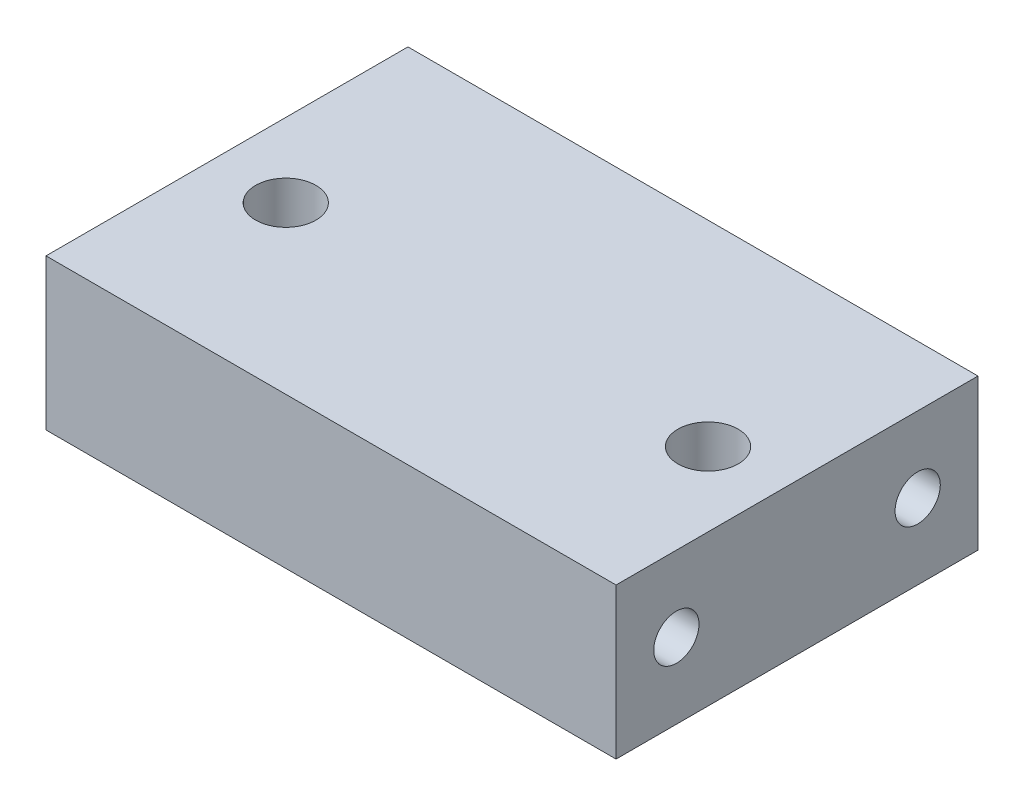
ISO-10303-21;
HEADER;
FILE_DESCRIPTION(('STEP AP214'),'2;1');
FILE_NAME('part.step','',(''),(''),'','','');
FILE_SCHEMA(('AUTOMOTIVE_DESIGN { 1 0 10303 214 1 1 1 1 }'));
ENDSEC;
DATA;
#1=APPLICATION_CONTEXT('core data for automotive mechanical design processes');
#2=APPLICATION_PROTOCOL_DEFINITION('international standard','automotive_design',2000,#1);
#3=PRODUCT_CONTEXT('',#1,'mechanical');
#4=PRODUCT('Part','Part','',(#3));
#5=PRODUCT_RELATED_PRODUCT_CATEGORY('part','',(#4));
#6=PRODUCT_DEFINITION_FORMATION('','',#4);
#7=PRODUCT_DEFINITION_CONTEXT('part definition',#1,'design');
#8=PRODUCT_DEFINITION('design','',#6,#7);
#9=PRODUCT_DEFINITION_SHAPE('','',#8);
#10=(LENGTH_UNIT() NAMED_UNIT(*) SI_UNIT(.MILLI.,.METRE.));
#11=(NAMED_UNIT(*) PLANE_ANGLE_UNIT() SI_UNIT($,.RADIAN.));
#12=(NAMED_UNIT(*) SI_UNIT($,.STERADIAN.) SOLID_ANGLE_UNIT());
#13=UNCERTAINTY_MEASURE_WITH_UNIT(LENGTH_MEASURE(1.E-05),#10,'distance_accuracy_value','');
#14=(GEOMETRIC_REPRESENTATION_CONTEXT(3) GLOBAL_UNCERTAINTY_ASSIGNED_CONTEXT((#13)) GLOBAL_UNIT_ASSIGNED_CONTEXT((#10,
#11,#12)) REPRESENTATION_CONTEXT('',''));
#15=CARTESIAN_POINT('',(0.,0.,0.));
#16=DIRECTION('',(0.,0.,1.));
#17=DIRECTION('',(1.,0.,0.));
#18=AXIS2_PLACEMENT_3D('',#15,#16,#17);
#19=CARTESIAN_POINT('',(18.9,10.,12.));
#20=DIRECTION('',(-1.,0.,0.));
#21=DIRECTION('',(0.,0.,1.));
#22=AXIS2_PLACEMENT_3D('',#19,#20,#21);
#23=PLANE('',#22);
#24=CARTESIAN_POINT('',(18.9,5.,8.));
#25=DIRECTION('',(1.,0.,0.));
#26=DIRECTION('',(0.,0.,-1.));
#27=AXIS2_PLACEMENT_3D('',#24,#25,#26);
#28=CIRCLE('',#27,1.49999999999999);
#29=CARTESIAN_POINT('',(18.9,5.,6.50000000000001));
#30=VERTEX_POINT('',#29);
#31=EDGE_CURVE('E158',#30,#30,#28,.T.);
#32=ORIENTED_EDGE('',*,*,#31,.F.);
#33=EDGE_LOOP('',(#32));
#34=FACE_BOUND('',#33,.T.);
#35=CARTESIAN_POINT('',(18.9,5.,-8.));
#36=DIRECTION('',(1.,0.,0.));
#37=DIRECTION('',(0.,0.,-1.));
#38=AXIS2_PLACEMENT_3D('',#35,#36,#37);
#39=CIRCLE('',#38,1.49999999999999);
#40=CARTESIAN_POINT('',(18.9,5.,-9.49999999999999));
#41=VERTEX_POINT('',#40);
#42=EDGE_CURVE('E174',#41,#41,#39,.T.);
#43=ORIENTED_EDGE('',*,*,#42,.F.);
#44=EDGE_LOOP('',(#43));
#45=FACE_BOUND('',#44,.T.);
#46=DIRECTION('',(0.,0.,-1.));
#47=VECTOR('',#46,1.);
#48=CARTESIAN_POINT('',(18.9,0.,12.));
#49=LINE('',#48,#47);
#50=CARTESIAN_POINT('',(18.9,0.,12.));
#51=VERTEX_POINT('',#50);
#52=CARTESIAN_POINT('',(18.9,0.,-12.));
#53=VERTEX_POINT('',#52);
#54=EDGE_CURVE('E221',#51,#53,#49,.T.);
#55=ORIENTED_EDGE('',*,*,#54,.T.);
#56=DIRECTION('',(0.,-1.,0.));
#57=VECTOR('',#56,1.);
#58=CARTESIAN_POINT('',(18.9,10.,-12.));
#59=LINE('',#58,#57);
#60=CARTESIAN_POINT('',(18.9,10.,-12.));
#61=VERTEX_POINT('',#60);
#62=EDGE_CURVE('E11',#61,#53,#59,.T.);
#63=ORIENTED_EDGE('',*,*,#62,.F.);
#64=DIRECTION('',(0.,0.,-1.));
#65=VECTOR('',#64,1.);
#66=CARTESIAN_POINT('',(18.9,10.,12.));
#67=LINE('',#66,#65);
#68=CARTESIAN_POINT('',(18.9,10.,12.));
#69=VERTEX_POINT('',#68);
#70=EDGE_CURVE('E222',#69,#61,#67,.T.);
#71=ORIENTED_EDGE('',*,*,#70,.F.);
#72=DIRECTION('',(0.,-1.,0.));
#73=VECTOR('',#72,1.);
#74=CARTESIAN_POINT('',(18.9,10.,12.));
#75=LINE('',#74,#73);
#76=EDGE_CURVE('E232',#69,#51,#75,.T.);
#77=ORIENTED_EDGE('',*,*,#76,.T.);
#78=EDGE_LOOP('',(#55,#63,#71,#77));
#79=FACE_BOUND('',#78,.T.);
#80=ADVANCED_FACE('F41',(#34,#45,#79),#23,.F.);
#81=CARTESIAN_POINT('',(-18.9,10.,-12.));
#82=DIRECTION('',(0.,0.,1.));
#83=DIRECTION('',(1.,0.,0.));
#84=AXIS2_PLACEMENT_3D('',#81,#82,#83);
#85=PLANE('',#84);
#86=DIRECTION('',(-1.,0.,0.));
#87=VECTOR('',#86,1.);
#88=CARTESIAN_POINT('',(-18.9,0.,-12.));
#89=LINE('',#88,#87);
#90=CARTESIAN_POINT('',(-18.9,0.,-12.));
#91=VERTEX_POINT('',#90);
#92=EDGE_CURVE('E236',#53,#91,#89,.T.);
#93=ORIENTED_EDGE('',*,*,#92,.T.);
#94=DIRECTION('',(0.,-1.,0.));
#95=VECTOR('',#94,1.);
#96=CARTESIAN_POINT('',(-18.9,10.,-12.));
#97=LINE('',#96,#95);
#98=CARTESIAN_POINT('',(-18.9,10.,-12.));
#99=VERTEX_POINT('',#98);
#100=EDGE_CURVE('E50',#99,#91,#97,.T.);
#101=ORIENTED_EDGE('',*,*,#100,.F.);
#102=DIRECTION('',(-1.,0.,0.));
#103=VECTOR('',#102,1.);
#104=CARTESIAN_POINT('',(-18.9,10.,-12.));
#105=LINE('',#104,#103);
#106=EDGE_CURVE('E99',#61,#99,#105,.T.);
#107=ORIENTED_EDGE('',*,*,#106,.F.);
#108=ORIENTED_EDGE('',*,*,#62,.T.);
#109=EDGE_LOOP('',(#93,#101,#107,#108));
#110=FACE_BOUND('',#109,.T.);
#111=ADVANCED_FACE('F266',(#110),#85,.F.);
#112=CARTESIAN_POINT('',(-18.9,10.,12.));
#113=DIRECTION('',(1.,0.,0.));
#114=DIRECTION('',(0.,0.,-1.));
#115=AXIS2_PLACEMENT_3D('',#112,#113,#114);
#116=PLANE('',#115);
#117=CARTESIAN_POINT('',(-18.9,5.,8.));
#118=DIRECTION('',(-1.,0.,0.));
#119=DIRECTION('',(0.,0.,1.));
#120=AXIS2_PLACEMENT_3D('',#117,#118,#119);
#121=CIRCLE('',#120,1.49999999999999);
#122=CARTESIAN_POINT('',(-18.9,5.,9.49999999999999));
#123=VERTEX_POINT('',#122);
#124=EDGE_CURVE('E510',#123,#123,#121,.T.);
#125=ORIENTED_EDGE('',*,*,#124,.F.);
#126=EDGE_LOOP('',(#125));
#127=FACE_BOUND('',#126,.T.);
#128=CARTESIAN_POINT('',(-18.9,5.,-8.));
#129=DIRECTION('',(-1.,0.,0.));
#130=DIRECTION('',(0.,0.,1.));
#131=AXIS2_PLACEMENT_3D('',#128,#129,#130);
#132=CIRCLE('',#131,1.49999999999999);
#133=CARTESIAN_POINT('',(-18.9,5.,-6.50000000000001));
#134=VERTEX_POINT('',#133);
#135=EDGE_CURVE('E133',#134,#134,#132,.T.);
#136=ORIENTED_EDGE('',*,*,#135,.F.);
#137=EDGE_LOOP('',(#136));
#138=FACE_BOUND('',#137,.T.);
#139=DIRECTION('',(0.,0.,1.));
#140=VECTOR('',#139,1.);
#141=CARTESIAN_POINT('',(-18.9,0.,12.));
#142=LINE('',#141,#140);
#143=CARTESIAN_POINT('',(-18.9,0.,12.));
#144=VERTEX_POINT('',#143);
#145=EDGE_CURVE('E84',#91,#144,#142,.T.);
#146=ORIENTED_EDGE('',*,*,#145,.T.);
#147=DIRECTION('',(0.,-1.,0.));
#148=VECTOR('',#147,1.);
#149=CARTESIAN_POINT('',(-18.9,10.,12.));
#150=LINE('',#149,#148);
#151=CARTESIAN_POINT('',(-18.9,10.,12.));
#152=VERTEX_POINT('',#151);
#153=EDGE_CURVE('E245',#152,#144,#150,.T.);
#154=ORIENTED_EDGE('',*,*,#153,.F.);
#155=DIRECTION('',(0.,0.,1.));
#156=VECTOR('',#155,1.);
#157=CARTESIAN_POINT('',(-18.9,10.,12.));
#158=LINE('',#157,#156);
#159=EDGE_CURVE('E227',#99,#152,#158,.T.);
#160=ORIENTED_EDGE('',*,*,#159,.F.);
#161=ORIENTED_EDGE('',*,*,#100,.T.);
#162=EDGE_LOOP('',(#146,#154,#160,#161));
#163=FACE_BOUND('',#162,.T.);
#164=ADVANCED_FACE('F249',(#127,#138,#163),#116,.F.);
#165=CARTESIAN_POINT('',(-18.9,10.,12.));
#166=DIRECTION('',(0.,0.,-1.));
#167=DIRECTION('',(-1.,0.,0.));
#168=AXIS2_PLACEMENT_3D('',#165,#166,#167);
#169=PLANE('',#168);
#170=DIRECTION('',(1.,0.,0.));
#171=VECTOR('',#170,1.);
#172=CARTESIAN_POINT('',(-18.9,0.,12.));
#173=LINE('',#172,#171);
#174=EDGE_CURVE('E92',#144,#51,#173,.T.);
#175=ORIENTED_EDGE('',*,*,#174,.T.);
#176=ORIENTED_EDGE('',*,*,#76,.F.);
#177=DIRECTION('',(1.,0.,0.));
#178=VECTOR('',#177,1.);
#179=CARTESIAN_POINT('',(-18.9,10.,12.));
#180=LINE('',#179,#178);
#181=EDGE_CURVE('E61',#152,#69,#180,.T.);
#182=ORIENTED_EDGE('',*,*,#181,.F.);
#183=ORIENTED_EDGE('',*,*,#153,.T.);
#184=EDGE_LOOP('',(#175,#176,#182,#183));
#185=FACE_BOUND('',#184,.T.);
#186=ADVANCED_FACE('F256',(#185),#169,.F.);
#187=CARTESIAN_POINT('',(0.,10.,0.));
#188=DIRECTION('',(0.,-1.,0.));
#189=DIRECTION('',(0.,0.,-1.));
#190=AXIS2_PLACEMENT_3D('',#187,#188,#189);
#191=PLANE('',#190);
#192=CARTESIAN_POINT('',(-14.,10.,1.));
#193=DIRECTION('',(0.,1.,0.));
#194=DIRECTION('',(0.,0.,1.));
#195=AXIS2_PLACEMENT_3D('',#192,#193,#194);
#196=CIRCLE('',#195,1.99999999999999);
#197=CARTESIAN_POINT('',(-14.,10.,3.));
#198=VERTEX_POINT('',#197);
#199=EDGE_CURVE('E190',#198,#198,#196,.T.);
#200=ORIENTED_EDGE('',*,*,#199,.F.);
#201=EDGE_LOOP('',(#200));
#202=FACE_BOUND('',#201,.T.);
#203=CARTESIAN_POINT('',(14.,10.,1.));
#204=DIRECTION('',(0.,1.,0.));
#205=DIRECTION('',(0.,0.,1.));
#206=AXIS2_PLACEMENT_3D('',#203,#204,#205);
#207=CIRCLE('',#206,1.99999999999999);
#208=CARTESIAN_POINT('',(14.,10.,2.99999999999999));
#209=VERTEX_POINT('',#208);
#210=EDGE_CURVE('E205',#209,#209,#207,.T.);
#211=ORIENTED_EDGE('',*,*,#210,.F.);
#212=EDGE_LOOP('',(#211));
#213=FACE_BOUND('',#212,.T.);
#214=ORIENTED_EDGE('',*,*,#70,.T.);
#215=ORIENTED_EDGE('',*,*,#106,.T.);
#216=ORIENTED_EDGE('',*,*,#159,.T.);
#217=ORIENTED_EDGE('',*,*,#181,.T.);
#218=EDGE_LOOP('',(#214,#215,#216,#217));
#219=FACE_BOUND('',#218,.T.);
#220=ADVANCED_FACE('F258',(#202,#213,#219),#191,.F.);
#221=CARTESIAN_POINT('',(0.,0.,0.));
#222=DIRECTION('',(0.,-1.,0.));
#223=DIRECTION('',(0.,0.,-1.));
#224=AXIS2_PLACEMENT_3D('',#221,#222,#223);
#225=PLANE('',#224);
#226=ORIENTED_EDGE('',*,*,#54,.F.);
#227=ORIENTED_EDGE('',*,*,#174,.F.);
#228=ORIENTED_EDGE('',*,*,#145,.F.);
#229=ORIENTED_EDGE('',*,*,#92,.F.);
#230=EDGE_LOOP('',(#226,#227,#228,#229));
#231=FACE_BOUND('',#230,.T.);
#232=ADVANCED_FACE('F252',(#231),#225,.T.);
#233=CARTESIAN_POINT('',(14.,2.5,1.));
#234=DIRECTION('',(0.,1.,0.));
#235=DIRECTION('',(0.,0.,1.));
#236=AXIS2_PLACEMENT_3D('',#233,#234,#235);
#237=CONICAL_SURFACE('',#236,1.65,1.02974425867665);
#238=CARTESIAN_POINT('',(14.,1.50857997860453,1.));
#239=VERTEX_POINT('',#238);
#240=VERTEX_LOOP('',#239);
#241=FACE_BOUND('',#240,.T.);
#242=CARTESIAN_POINT('',(14.,2.5,1.));
#243=DIRECTION('',(0.,1.,0.));
#244=DIRECTION('',(0.,0.,1.));
#245=AXIS2_PLACEMENT_3D('',#242,#243,#244);
#246=CIRCLE('',#245,1.65);
#247=CARTESIAN_POINT('',(14.,2.5,2.65));
#248=VERTEX_POINT('',#247);
#249=EDGE_CURVE('E217',#248,#248,#246,.T.);
#250=ORIENTED_EDGE('',*,*,#249,.T.);
#251=EDGE_LOOP('',(#250));
#252=FACE_BOUND('',#251,.T.);
#253=ADVANCED_FACE('F332',(#241,#252),#237,.F.);
#254=CARTESIAN_POINT('',(14.,10.,1.));
#255=DIRECTION('',(0.,1.,0.));
#256=DIRECTION('',(0.,0.,1.));
#257=AXIS2_PLACEMENT_3D('',#254,#255,#256);
#258=CYLINDRICAL_SURFACE('',#257,1.65);
#259=ORIENTED_EDGE('',*,*,#249,.F.);
#260=EDGE_LOOP('',(#259));
#261=FACE_BOUND('',#260,.T.);
#262=CARTESIAN_POINT('',(14.,2.,1.));
#263=DIRECTION('',(0.,1.,0.));
#264=DIRECTION('',(0.,0.,1.));
#265=AXIS2_PLACEMENT_3D('',#262,#263,#264);
#266=CIRCLE('',#265,1.65);
#267=CARTESIAN_POINT('',(14.,2.,2.65));
#268=VERTEX_POINT('',#267);
#269=EDGE_CURVE('E213',#268,#268,#266,.T.);
#270=ORIENTED_EDGE('',*,*,#269,.T.);
#271=EDGE_LOOP('',(#270));
#272=FACE_BOUND('',#271,.T.);
#273=ADVANCED_FACE('F328',(#261,#272),#258,.T.);
#274=CARTESIAN_POINT('',(15.65,2.,1.));
#275=DIRECTION('',(0.,-1.,0.));
#276=DIRECTION('',(0.,0.,-1.));
#277=AXIS2_PLACEMENT_3D('',#274,#275,#276);
#278=PLANE('',#277);
#279=ORIENTED_EDGE('',*,*,#269,.F.);
#280=EDGE_LOOP('',(#279));
#281=FACE_BOUND('',#280,.T.);
#282=CARTESIAN_POINT('',(14.,2.,1.));
#283=DIRECTION('',(0.,1.,0.));
#284=DIRECTION('',(0.,0.,1.));
#285=AXIS2_PLACEMENT_3D('',#282,#283,#284);
#286=CIRCLE('',#285,2.);
#287=CARTESIAN_POINT('',(14.,2.,3.));
#288=VERTEX_POINT('',#287);
#289=EDGE_CURVE('E209',#288,#288,#286,.T.);
#290=ORIENTED_EDGE('',*,*,#289,.T.);
#291=EDGE_LOOP('',(#290));
#292=FACE_BOUND('',#291,.T.);
#293=ADVANCED_FACE('F324',(#281,#292),#278,.F.);
#294=CARTESIAN_POINT('',(14.,10.,1.));
#295=DIRECTION('',(0.,1.,0.));
#296=DIRECTION('',(0.,0.,1.));
#297=AXIS2_PLACEMENT_3D('',#294,#295,#296);
#298=CYLINDRICAL_SURFACE('',#297,1.99999999999999);
#299=ORIENTED_EDGE('',*,*,#289,.F.);
#300=EDGE_LOOP('',(#299));
#301=FACE_BOUND('',#300,.T.);
#302=ORIENTED_EDGE('',*,*,#210,.T.);
#303=EDGE_LOOP('',(#302));
#304=FACE_BOUND('',#303,.T.);
#305=ADVANCED_FACE('F320',(#301,#304),#298,.F.);
#306=CARTESIAN_POINT('',(-14.,2.5,1.));
#307=DIRECTION('',(0.,1.,0.));
#308=DIRECTION('',(0.,0.,1.));
#309=AXIS2_PLACEMENT_3D('',#306,#307,#308);
#310=CONICAL_SURFACE('',#309,1.65,1.02974425867665);
#311=CARTESIAN_POINT('',(-14.,1.50857997860453,1.));
#312=VERTEX_POINT('',#311);
#313=VERTEX_LOOP('',#312);
#314=FACE_BOUND('',#313,.T.);
#315=CARTESIAN_POINT('',(-14.,2.5,1.));
#316=DIRECTION('',(0.,1.,0.));
#317=DIRECTION('',(0.,0.,1.));
#318=AXIS2_PLACEMENT_3D('',#315,#316,#317);
#319=CIRCLE('',#318,1.65);
#320=CARTESIAN_POINT('',(-14.,2.5,2.65));
#321=VERTEX_POINT('',#320);
#322=EDGE_CURVE('E201',#321,#321,#319,.T.);
#323=ORIENTED_EDGE('',*,*,#322,.T.);
#324=EDGE_LOOP('',(#323));
#325=FACE_BOUND('',#324,.T.);
#326=ADVANCED_FACE('F316',(#314,#325),#310,.F.);
#327=CARTESIAN_POINT('',(-14.,10.,1.));
#328=DIRECTION('',(0.,1.,0.));
#329=DIRECTION('',(0.,0.,1.));
#330=AXIS2_PLACEMENT_3D('',#327,#328,#329);
#331=CYLINDRICAL_SURFACE('',#330,1.65);
#332=ORIENTED_EDGE('',*,*,#322,.F.);
#333=EDGE_LOOP('',(#332));
#334=FACE_BOUND('',#333,.T.);
#335=CARTESIAN_POINT('',(-14.,2.,1.));
#336=DIRECTION('',(0.,1.,0.));
#337=DIRECTION('',(0.,0.,1.));
#338=AXIS2_PLACEMENT_3D('',#335,#336,#337);
#339=CIRCLE('',#338,1.65);
#340=CARTESIAN_POINT('',(-14.,2.,2.65));
#341=VERTEX_POINT('',#340);
#342=EDGE_CURVE('E197',#341,#341,#339,.T.);
#343=ORIENTED_EDGE('',*,*,#342,.T.);
#344=EDGE_LOOP('',(#343));
#345=FACE_BOUND('',#344,.T.);
#346=ADVANCED_FACE('F312',(#334,#345),#331,.T.);
#347=CARTESIAN_POINT('',(-12.35,2.,1.));
#348=DIRECTION('',(0.,-1.,0.));
#349=DIRECTION('',(0.,0.,-1.));
#350=AXIS2_PLACEMENT_3D('',#347,#348,#349);
#351=PLANE('',#350);
#352=ORIENTED_EDGE('',*,*,#342,.F.);
#353=EDGE_LOOP('',(#352));
#354=FACE_BOUND('',#353,.T.);
#355=CARTESIAN_POINT('',(-14.,2.,1.));
#356=DIRECTION('',(0.,1.,0.));
#357=DIRECTION('',(0.,0.,1.));
#358=AXIS2_PLACEMENT_3D('',#355,#356,#357);
#359=CIRCLE('',#358,1.99999999999999);
#360=CARTESIAN_POINT('',(-14.,2.,3.));
#361=VERTEX_POINT('',#360);
#362=EDGE_CURVE('E193',#361,#361,#359,.T.);
#363=ORIENTED_EDGE('',*,*,#362,.T.);
#364=EDGE_LOOP('',(#363));
#365=FACE_BOUND('',#364,.T.);
#366=ADVANCED_FACE('F308',(#354,#365),#351,.F.);
#367=CARTESIAN_POINT('',(-14.,10.,1.));
#368=DIRECTION('',(0.,1.,0.));
#369=DIRECTION('',(0.,0.,1.));
#370=AXIS2_PLACEMENT_3D('',#367,#368,#369);
#371=CYLINDRICAL_SURFACE('',#370,1.99999999999999);
#372=ORIENTED_EDGE('',*,*,#362,.F.);
#373=EDGE_LOOP('',(#372));
#374=FACE_BOUND('',#373,.T.);
#375=ORIENTED_EDGE('',*,*,#199,.T.);
#376=EDGE_LOOP('',(#375));
#377=FACE_BOUND('',#376,.T.);
#378=ADVANCED_FACE('F304',(#374,#377),#371,.F.);
#379=CARTESIAN_POINT('',(6.89999999999999,5.,-8.));
#380=DIRECTION('',(1.,0.,0.));
#381=DIRECTION('',(0.,0.,-1.));
#382=AXIS2_PLACEMENT_3D('',#379,#380,#381);
#383=CONICAL_SURFACE('',#382,1.25,1.02974425867665);
#384=CARTESIAN_POINT('',(6.14892422621554,5.,-8.));
#385=VERTEX_POINT('',#384);
#386=VERTEX_LOOP('',#385);
#387=FACE_BOUND('',#386,.T.);
#388=CARTESIAN_POINT('',(6.89999999999999,5.,-8.));
#389=DIRECTION('',(1.,0.,0.));
#390=DIRECTION('',(0.,0.,-1.));
#391=AXIS2_PLACEMENT_3D('',#388,#389,#390);
#392=CIRCLE('',#391,1.25);
#393=CARTESIAN_POINT('',(6.89999999999999,5.,-9.25));
#394=VERTEX_POINT('',#393);
#395=EDGE_CURVE('E186',#394,#394,#392,.T.);
#396=ORIENTED_EDGE('',*,*,#395,.T.);
#397=EDGE_LOOP('',(#396));
#398=FACE_BOUND('',#397,.T.);
#399=ADVANCED_FACE('F300',(#387,#398),#383,.F.);
#400=CARTESIAN_POINT('',(18.9,5.,-8.));
#401=DIRECTION('',(1.,0.,0.));
#402=DIRECTION('',(0.,0.,-1.));
#403=AXIS2_PLACEMENT_3D('',#400,#401,#402);
#404=CYLINDRICAL_SURFACE('',#403,1.25);
#405=ORIENTED_EDGE('',*,*,#395,.F.);
#406=EDGE_LOOP('',(#405));
#407=FACE_BOUND('',#406,.T.);
#408=CARTESIAN_POINT('',(7.39999999999999,5.,-8.));
#409=DIRECTION('',(1.,0.,0.));
#410=DIRECTION('',(0.,0.,-1.));
#411=AXIS2_PLACEMENT_3D('',#408,#409,#410);
#412=CIRCLE('',#411,1.25);
#413=CARTESIAN_POINT('',(7.39999999999999,5.,-9.25));
#414=VERTEX_POINT('',#413);
#415=EDGE_CURVE('E182',#414,#414,#412,.T.);
#416=ORIENTED_EDGE('',*,*,#415,.T.);
#417=EDGE_LOOP('',(#416));
#418=FACE_BOUND('',#417,.T.);
#419=ADVANCED_FACE('F292',(#407,#418),#404,.F.);
#420=CARTESIAN_POINT('',(7.39999999999999,6.25,-8.));
#421=DIRECTION('',(-1.,0.,0.));
#422=DIRECTION('',(0.,0.,1.));
#423=AXIS2_PLACEMENT_3D('',#420,#421,#422);
#424=PLANE('',#423);
#425=ORIENTED_EDGE('',*,*,#415,.F.);
#426=EDGE_LOOP('',(#425));
#427=FACE_BOUND('',#426,.T.);
#428=CARTESIAN_POINT('',(7.39999999999999,5.,-8.));
#429=DIRECTION('',(1.,0.,0.));
#430=DIRECTION('',(0.,0.,-1.));
#431=AXIS2_PLACEMENT_3D('',#428,#429,#430);
#432=CIRCLE('',#431,1.5);
#433=CARTESIAN_POINT('',(7.39999999999999,5.,-9.5));
#434=VERTEX_POINT('',#433);
#435=EDGE_CURVE('E178',#434,#434,#432,.T.);
#436=ORIENTED_EDGE('',*,*,#435,.T.);
#437=EDGE_LOOP('',(#436));
#438=FACE_BOUND('',#437,.T.);
#439=ADVANCED_FACE('F282',(#427,#438),#424,.F.);
#440=CARTESIAN_POINT('',(18.9,5.,-8.));
#441=DIRECTION('',(1.,0.,0.));
#442=DIRECTION('',(0.,0.,-1.));
#443=AXIS2_PLACEMENT_3D('',#440,#441,#442);
#444=CYLINDRICAL_SURFACE('',#443,1.5);
#445=ORIENTED_EDGE('',*,*,#435,.F.);
#446=EDGE_LOOP('',(#445));
#447=FACE_BOUND('',#446,.T.);
#448=ORIENTED_EDGE('',*,*,#42,.T.);
#449=EDGE_LOOP('',(#448));
#450=FACE_BOUND('',#449,.T.);
#451=ADVANCED_FACE('F279',(#447,#450),#444,.F.);
#452=CARTESIAN_POINT('',(6.89999999999999,5.,8.));
#453=DIRECTION('',(1.,0.,0.));
#454=DIRECTION('',(0.,0.,-1.));
#455=AXIS2_PLACEMENT_3D('',#452,#453,#454);
#456=CONICAL_SURFACE('',#455,1.25,1.02974425867665);
#457=CARTESIAN_POINT('',(6.14892422621554,5.,8.));
#458=VERTEX_POINT('',#457);
#459=VERTEX_LOOP('',#458);
#460=FACE_BOUND('',#459,.T.);
#461=CARTESIAN_POINT('',(6.89999999999999,5.,8.));
#462=DIRECTION('',(1.,0.,0.));
#463=DIRECTION('',(0.,0.,-1.));
#464=AXIS2_PLACEMENT_3D('',#461,#462,#463);
#465=CIRCLE('',#464,1.25);
#466=CARTESIAN_POINT('',(6.89999999999999,5.,6.75));
#467=VERTEX_POINT('',#466);
#468=EDGE_CURVE('E170',#467,#467,#465,.T.);
#469=ORIENTED_EDGE('',*,*,#468,.T.);
#470=EDGE_LOOP('',(#469));
#471=FACE_BOUND('',#470,.T.);
#472=ADVANCED_FACE('F281',(#460,#471),#456,.F.);
#473=CARTESIAN_POINT('',(18.9,5.,8.));
#474=DIRECTION('',(1.,0.,0.));
#475=DIRECTION('',(0.,0.,-1.));
#476=AXIS2_PLACEMENT_3D('',#473,#474,#475);
#477=CYLINDRICAL_SURFACE('',#476,1.25);
#478=ORIENTED_EDGE('',*,*,#468,.F.);
#479=EDGE_LOOP('',(#478));
#480=FACE_BOUND('',#479,.T.);
#481=CARTESIAN_POINT('',(7.39999999999999,5.,8.));
#482=DIRECTION('',(1.,0.,0.));
#483=DIRECTION('',(0.,0.,-1.));
#484=AXIS2_PLACEMENT_3D('',#481,#482,#483);
#485=CIRCLE('',#484,1.25);
#486=CARTESIAN_POINT('',(7.39999999999999,5.,6.75));
#487=VERTEX_POINT('',#486);
#488=EDGE_CURVE('E166',#487,#487,#485,.T.);
#489=ORIENTED_EDGE('',*,*,#488,.T.);
#490=EDGE_LOOP('',(#489));
#491=FACE_BOUND('',#490,.T.);
#492=ADVANCED_FACE('F289',(#480,#491),#477,.F.);
#493=CARTESIAN_POINT('',(7.39999999999999,6.25,8.));
#494=DIRECTION('',(-1.,0.,0.));
#495=DIRECTION('',(0.,0.,1.));
#496=AXIS2_PLACEMENT_3D('',#493,#494,#495);
#497=PLANE('',#496);
#498=ORIENTED_EDGE('',*,*,#488,.F.);
#499=EDGE_LOOP('',(#498));
#500=FACE_BOUND('',#499,.T.);
#501=CARTESIAN_POINT('',(7.39999999999999,5.,8.));
#502=DIRECTION('',(1.,0.,0.));
#503=DIRECTION('',(0.,0.,-1.));
#504=AXIS2_PLACEMENT_3D('',#501,#502,#503);
#505=CIRCLE('',#504,1.5);
#506=CARTESIAN_POINT('',(7.39999999999999,5.,6.5));
#507=VERTEX_POINT('',#506);
#508=EDGE_CURVE('E162',#507,#507,#505,.T.);
#509=ORIENTED_EDGE('',*,*,#508,.T.);
#510=EDGE_LOOP('',(#509));
#511=FACE_BOUND('',#510,.T.);
#512=ADVANCED_FACE('F404',(#500,#511),#497,.F.);
#513=CARTESIAN_POINT('',(18.9,5.,8.));
#514=DIRECTION('',(1.,0.,0.));
#515=DIRECTION('',(0.,0.,-1.));
#516=AXIS2_PLACEMENT_3D('',#513,#514,#515);
#517=CYLINDRICAL_SURFACE('',#516,1.5);
#518=ORIENTED_EDGE('',*,*,#508,.F.);
#519=EDGE_LOOP('',(#518));
#520=FACE_BOUND('',#519,.T.);
#521=ORIENTED_EDGE('',*,*,#31,.T.);
#522=EDGE_LOOP('',(#521));
#523=FACE_BOUND('',#522,.T.);
#524=ADVANCED_FACE('F412',(#520,#523),#517,.F.);
#525=CARTESIAN_POINT('',(-6.89999999999999,5.,-8.));
#526=DIRECTION('',(-1.,0.,0.));
#527=DIRECTION('',(0.,0.,1.));
#528=AXIS2_PLACEMENT_3D('',#525,#526,#527);
#529=CONICAL_SURFACE('',#528,1.25,1.02974425867665);
#530=CARTESIAN_POINT('',(-6.14892422621554,5.,-8.));
#531=VERTEX_POINT('',#530);
#532=VERTEX_LOOP('',#531);
#533=FACE_BOUND('',#532,.T.);
#534=CARTESIAN_POINT('',(-6.89999999999999,5.,-8.));
#535=DIRECTION('',(-1.,0.,0.));
#536=DIRECTION('',(0.,0.,1.));
#537=AXIS2_PLACEMENT_3D('',#534,#535,#536);
#538=CIRCLE('',#537,1.25);
#539=CARTESIAN_POINT('',(-6.89999999999999,5.,-6.75));
#540=VERTEX_POINT('',#539);
#541=EDGE_CURVE('E154',#540,#540,#538,.T.);
#542=ORIENTED_EDGE('',*,*,#541,.T.);
#543=EDGE_LOOP('',(#542));
#544=FACE_BOUND('',#543,.T.);
#545=ADVANCED_FACE('F422',(#533,#544),#529,.F.);
#546=CARTESIAN_POINT('',(-18.9,5.,-8.));
#547=DIRECTION('',(-1.,0.,0.));
#548=DIRECTION('',(0.,0.,1.));
#549=AXIS2_PLACEMENT_3D('',#546,#547,#548);
#550=CYLINDRICAL_SURFACE('',#549,1.25);
#551=ORIENTED_EDGE('',*,*,#541,.F.);
#552=EDGE_LOOP('',(#551));
#553=FACE_BOUND('',#552,.T.);
#554=CARTESIAN_POINT('',(-7.39999999999999,5.,-8.));
#555=DIRECTION('',(-1.,0.,0.));
#556=DIRECTION('',(0.,0.,1.));
#557=AXIS2_PLACEMENT_3D('',#554,#555,#556);
#558=CIRCLE('',#557,1.25);
#559=CARTESIAN_POINT('',(-7.39999999999999,5.,-6.75));
#560=VERTEX_POINT('',#559);
#561=EDGE_CURVE('E150',#560,#560,#558,.T.);
#562=ORIENTED_EDGE('',*,*,#561,.T.);
#563=EDGE_LOOP('',(#562));
#564=FACE_BOUND('',#563,.T.);
#565=ADVANCED_FACE('F439',(#553,#564),#550,.F.);
#566=CARTESIAN_POINT('',(-7.39999999999999,6.25,-8.));
#567=DIRECTION('',(1.,0.,0.));
#568=DIRECTION('',(0.,0.,-1.));
#569=AXIS2_PLACEMENT_3D('',#566,#567,#568);
#570=PLANE('',#569);
#571=ORIENTED_EDGE('',*,*,#561,.F.);
#572=EDGE_LOOP('',(#571));
#573=FACE_BOUND('',#572,.T.);
#574=CARTESIAN_POINT('',(-7.39999999999999,5.,-8.));
#575=DIRECTION('',(-1.,0.,0.));
#576=DIRECTION('',(0.,0.,1.));
#577=AXIS2_PLACEMENT_3D('',#574,#575,#576);
#578=CIRCLE('',#577,1.5);
#579=CARTESIAN_POINT('',(-7.39999999999999,5.,-6.5));
#580=VERTEX_POINT('',#579);
#581=EDGE_CURVE('E140',#580,#580,#578,.T.);
#582=ORIENTED_EDGE('',*,*,#581,.T.);
#583=EDGE_LOOP('',(#582));
#584=FACE_BOUND('',#583,.T.);
#585=ADVANCED_FACE('F449',(#573,#584),#570,.F.);
#586=CARTESIAN_POINT('',(-18.9,5.,-8.));
#587=DIRECTION('',(-1.,0.,0.));
#588=DIRECTION('',(0.,0.,1.));
#589=AXIS2_PLACEMENT_3D('',#586,#587,#588);
#590=CYLINDRICAL_SURFACE('',#589,1.5);
#591=ORIENTED_EDGE('',*,*,#581,.F.);
#592=EDGE_LOOP('',(#591));
#593=FACE_BOUND('',#592,.T.);
#594=ORIENTED_EDGE('',*,*,#135,.T.);
#595=EDGE_LOOP('',(#594));
#596=FACE_BOUND('',#595,.T.);
#597=ADVANCED_FACE('F126',(#593,#596),#590,.F.);
#598=CARTESIAN_POINT('',(-6.89999999999999,5.,8.));
#599=DIRECTION('',(-1.,0.,0.));
#600=DIRECTION('',(0.,0.,1.));
#601=AXIS2_PLACEMENT_3D('',#598,#599,#600);
#602=CONICAL_SURFACE('',#601,1.25,1.02974425867665);
#603=CARTESIAN_POINT('',(-6.14892422621554,5.,8.));
#604=VERTEX_POINT('',#603);
#605=VERTEX_LOOP('',#604);
#606=FACE_BOUND('',#605,.T.);
#607=CARTESIAN_POINT('',(-6.89999999999999,5.,8.));
#608=DIRECTION('',(-1.,0.,0.));
#609=DIRECTION('',(0.,0.,1.));
#610=AXIS2_PLACEMENT_3D('',#607,#608,#609);
#611=CIRCLE('',#610,1.25);
#612=CARTESIAN_POINT('',(-6.89999999999999,5.,9.25));
#613=VERTEX_POINT('',#612);
#614=EDGE_CURVE('E130',#613,#613,#611,.T.);
#615=ORIENTED_EDGE('',*,*,#614,.T.);
#616=EDGE_LOOP('',(#615));
#617=FACE_BOUND('',#616,.T.);
#618=ADVANCED_FACE('F122',(#606,#617),#602,.F.);
#619=CARTESIAN_POINT('',(-18.9,5.,8.));
#620=DIRECTION('',(-1.,0.,0.));
#621=DIRECTION('',(0.,0.,1.));
#622=AXIS2_PLACEMENT_3D('',#619,#620,#621);
#623=CYLINDRICAL_SURFACE('',#622,1.25);
#624=ORIENTED_EDGE('',*,*,#614,.F.);
#625=EDGE_LOOP('',(#624));
#626=FACE_BOUND('',#625,.T.);
#627=CARTESIAN_POINT('',(-7.39999999999999,5.,8.));
#628=DIRECTION('',(-1.,0.,0.));
#629=DIRECTION('',(0.,0.,1.));
#630=AXIS2_PLACEMENT_3D('',#627,#628,#629);
#631=CIRCLE('',#630,1.25);
#632=CARTESIAN_POINT('',(-7.39999999999999,5.,9.25));
#633=VERTEX_POINT('',#632);
#634=EDGE_CURVE('E134',#633,#633,#631,.T.);
#635=ORIENTED_EDGE('',*,*,#634,.T.);
#636=EDGE_LOOP('',(#635));
#637=FACE_BOUND('',#636,.T.);
#638=ADVANCED_FACE('F125',(#626,#637),#623,.F.);
#639=CARTESIAN_POINT('',(-7.39999999999999,6.25,8.));
#640=DIRECTION('',(1.,0.,0.));
#641=DIRECTION('',(0.,0.,-1.));
#642=AXIS2_PLACEMENT_3D('',#639,#640,#641);
#643=PLANE('',#642);
#644=ORIENTED_EDGE('',*,*,#634,.F.);
#645=EDGE_LOOP('',(#644));
#646=FACE_BOUND('',#645,.T.);
#647=CARTESIAN_POINT('',(-7.39999999999999,5.,8.));
#648=DIRECTION('',(-1.,0.,0.));
#649=DIRECTION('',(0.,0.,1.));
#650=AXIS2_PLACEMENT_3D('',#647,#648,#649);
#651=CIRCLE('',#650,1.5);
#652=CARTESIAN_POINT('',(-7.39999999999999,5.,9.5));
#653=VERTEX_POINT('',#652);
#654=EDGE_CURVE('E143',#653,#653,#651,.T.);
#655=ORIENTED_EDGE('',*,*,#654,.T.);
#656=EDGE_LOOP('',(#655));
#657=FACE_BOUND('',#656,.T.);
#658=ADVANCED_FACE('F482',(#646,#657),#643,.F.);
#659=CARTESIAN_POINT('',(-18.9,5.,8.));
#660=DIRECTION('',(-1.,0.,0.));
#661=DIRECTION('',(0.,0.,1.));
#662=AXIS2_PLACEMENT_3D('',#659,#660,#661);
#663=CYLINDRICAL_SURFACE('',#662,1.5);
#664=ORIENTED_EDGE('',*,*,#654,.F.);
#665=EDGE_LOOP('',(#664));
#666=FACE_BOUND('',#665,.T.);
#667=ORIENTED_EDGE('',*,*,#124,.T.);
#668=EDGE_LOOP('',(#667));
#669=FACE_BOUND('',#668,.T.);
#670=ADVANCED_FACE('F491',(#666,#669),#663,.F.);
#671=CLOSED_SHELL('',(#80,#111,#164,#186,#220,#232,#253,#273,#293,#305,#326,#346,#366,#378,#399,
#419,#439,#451,#472,#492,#512,#524,#545,#565,#585,#597,#618,#638,#658,#670));
#672=MANIFOLD_SOLID_BREP('B2',#671);
#673=ADVANCED_BREP_SHAPE_REPRESENTATION('',(#18,#672),#14);
#674=SHAPE_DEFINITION_REPRESENTATION(#9,#673);
ENDSEC;
END-ISO-10303-21;
